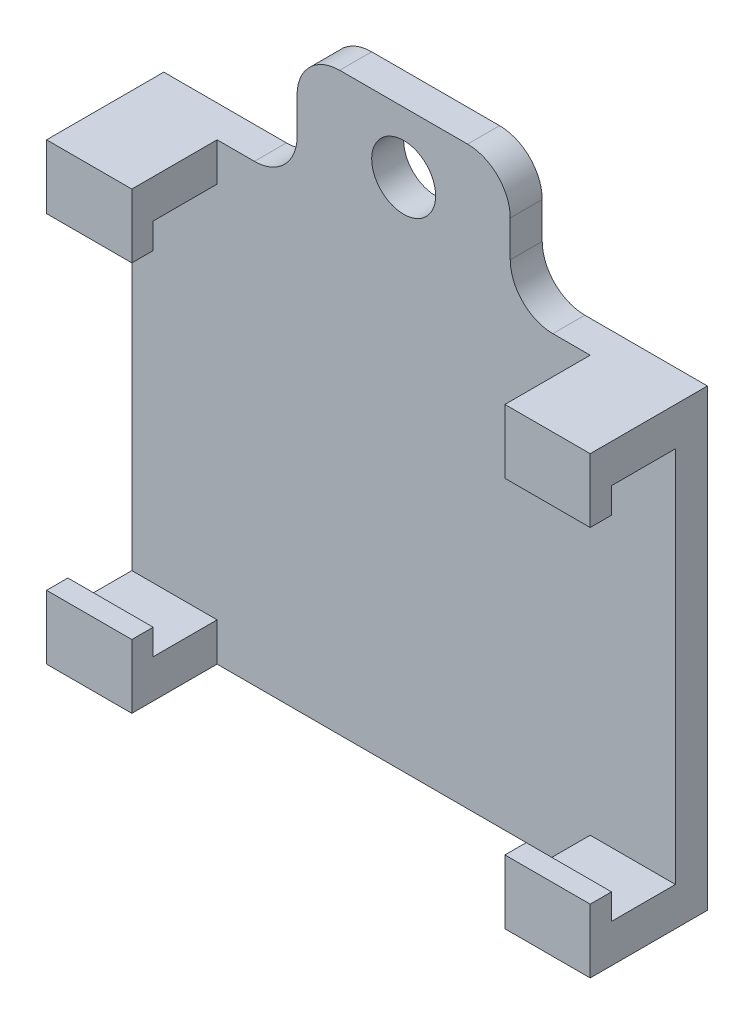
ISO-10303-21;
HEADER;
FILE_DESCRIPTION(('STEP AP214'),'2;1');
FILE_NAME('part.step','',(''),(''),'','','');
FILE_SCHEMA(('AUTOMOTIVE_DESIGN { 1 0 10303 214 1 1 1 1 }'));
ENDSEC;
DATA;
#1=APPLICATION_CONTEXT('core data for automotive mechanical design processes');
#2=APPLICATION_PROTOCOL_DEFINITION('international standard','automotive_design',2000,#1);
#3=PRODUCT_CONTEXT('',#1,'mechanical');
#4=PRODUCT('Part','Part','',(#3));
#5=PRODUCT_RELATED_PRODUCT_CATEGORY('part','',(#4));
#6=PRODUCT_DEFINITION_FORMATION('','',#4);
#7=PRODUCT_DEFINITION_CONTEXT('part definition',#1,'design');
#8=PRODUCT_DEFINITION('design','',#6,#7);
#9=PRODUCT_DEFINITION_SHAPE('','',#8);
#10=(LENGTH_UNIT() NAMED_UNIT(*) SI_UNIT(.MILLI.,.METRE.));
#11=(NAMED_UNIT(*) PLANE_ANGLE_UNIT() SI_UNIT($,.RADIAN.));
#12=(NAMED_UNIT(*) SI_UNIT($,.STERADIAN.) SOLID_ANGLE_UNIT());
#13=UNCERTAINTY_MEASURE_WITH_UNIT(LENGTH_MEASURE(1.E-05),#10,'distance_accuracy_value','');
#14=(GEOMETRIC_REPRESENTATION_CONTEXT(3) GLOBAL_UNCERTAINTY_ASSIGNED_CONTEXT((#13)) GLOBAL_UNIT_ASSIGNED_CONTEXT((#10,
#11,#12)) REPRESENTATION_CONTEXT('',''));
#15=CARTESIAN_POINT('',(0.,0.,0.));
#16=DIRECTION('',(0.,0.,1.));
#17=DIRECTION('',(1.,0.,0.));
#18=AXIS2_PLACEMENT_3D('',#15,#16,#17);
#19=CARTESIAN_POINT('',(0.,6.04999999999999,-17.95));
#20=DIRECTION('',(0.,1.,0.));
#21=DIRECTION('',(-1.,0.,0.));
#22=AXIS2_PLACEMENT_3D('',#19,#20,#21);
#23=PLANE('',#22);
#24=DIRECTION('',(-1.,0.,0.));
#25=VECTOR('',#24,1.);
#26=CARTESIAN_POINT('',(0.,6.05,-18.95));
#27=LINE('',#26,#25);
#28=CARTESIAN_POINT('',(4.00000000000001,6.05,-18.95));
#29=VERTEX_POINT('',#28);
#30=CARTESIAN_POINT('',(0.,6.05,-18.95));
#31=VERTEX_POINT('',#30);
#32=EDGE_CURVE('E445',#29,#31,#27,.T.);
#33=ORIENTED_EDGE('',*,*,#32,.F.);
#34=DIRECTION('',(0.,0.,1.));
#35=VECTOR('',#34,1.);
#36=CARTESIAN_POINT('',(4.00000000000001,6.04999999999999,-17.95));
#37=LINE('',#36,#35);
#38=CARTESIAN_POINT('',(4.00000000000001,6.04999999999999,-17.95));
#39=VERTEX_POINT('',#38);
#40=EDGE_CURVE('E411',#29,#39,#37,.T.);
#41=ORIENTED_EDGE('',*,*,#40,.T.);
#42=DIRECTION('',(1.,0.,0.));
#43=VECTOR('',#42,1.);
#44=CARTESIAN_POINT('',(0.,6.04999999999999,-17.95));
#45=LINE('',#44,#43);
#46=CARTESIAN_POINT('',(0.,6.04999999999999,-17.95));
#47=VERTEX_POINT('',#46);
#48=EDGE_CURVE('E493',#47,#39,#45,.T.);
#49=ORIENTED_EDGE('',*,*,#48,.F.);
#50=DIRECTION('',(0.,0.,-1.));
#51=VECTOR('',#50,1.);
#52=CARTESIAN_POINT('',(0.,6.04999999999999,-17.95));
#53=LINE('',#52,#51);
#54=EDGE_CURVE('E281',#47,#31,#53,.T.);
#55=ORIENTED_EDGE('',*,*,#54,.T.);
#56=EDGE_LOOP('',(#33,#41,#49,#55));
#57=FACE_BOUND('',#56,.T.);
#58=ADVANCED_FACE('F39',(#57),#23,.F.);
#59=CARTESIAN_POINT('',(0.,9.05,-17.95));
#60=DIRECTION('',(0.,-1.,0.));
#61=DIRECTION('',(1.,0.,0.));
#62=AXIS2_PLACEMENT_3D('',#59,#60,#61);
#63=PLANE('',#62);
#64=DIRECTION('',(1.,0.,0.));
#65=VECTOR('',#64,1.);
#66=CARTESIAN_POINT('',(0.,9.05000000000001,-21.95));
#67=LINE('',#66,#65);
#68=CARTESIAN_POINT('',(4.,9.05000000000001,-21.95));
#69=VERTEX_POINT('',#68);
#70=CARTESIAN_POINT('',(5.75,9.05000000000001,-21.95));
#71=VERTEX_POINT('',#70);
#72=EDGE_CURVE('E353',#69,#71,#67,.T.);
#73=ORIENTED_EDGE('',*,*,#72,.T.);
#74=DIRECTION('',(0.,0.,1.));
#75=VECTOR('',#74,1.);
#76=CARTESIAN_POINT('',(5.75,9.05000000000002,-23.45));
#77=LINE('',#76,#75);
#78=CARTESIAN_POINT('',(5.75,9.05000000000002,-23.45));
#79=VERTEX_POINT('',#78);
#80=EDGE_CURVE('E268',#71,#79,#77,.F.);
#81=ORIENTED_EDGE('',*,*,#80,.T.);
#82=DIRECTION('',(1.,0.,0.));
#83=VECTOR('',#82,1.);
#84=CARTESIAN_POINT('',(0.,9.05000000000002,-23.45));
#85=LINE('',#84,#83);
#86=CARTESIAN_POINT('',(0.,9.05000000000002,-23.45));
#87=VERTEX_POINT('',#86);
#88=EDGE_CURVE('E264',#87,#79,#85,.T.);
#89=ORIENTED_EDGE('',*,*,#88,.F.);
#90=DIRECTION('',(0.,0.,-1.));
#91=VECTOR('',#90,1.);
#92=CARTESIAN_POINT('',(0.,9.05,-17.95));
#93=LINE('',#92,#91);
#94=CARTESIAN_POINT('',(0.,9.05,-17.95));
#95=VERTEX_POINT('',#94);
#96=EDGE_CURVE('E248',#95,#87,#93,.T.);
#97=ORIENTED_EDGE('',*,*,#96,.F.);
#98=DIRECTION('',(-1.,0.,0.));
#99=VECTOR('',#98,1.);
#100=CARTESIAN_POINT('',(0.,9.05,-17.95));
#101=LINE('',#100,#99);
#102=CARTESIAN_POINT('',(4.00000000000001,9.05,-17.95));
#103=VERTEX_POINT('',#102);
#104=EDGE_CURVE('E498',#103,#95,#101,.T.);
#105=ORIENTED_EDGE('',*,*,#104,.F.);
#106=DIRECTION('',(0.,0.,-1.));
#107=VECTOR('',#106,1.);
#108=CARTESIAN_POINT('',(4.00000000000001,9.05,-17.95));
#109=LINE('',#108,#107);
#110=EDGE_CURVE('E414',#103,#69,#109,.T.);
#111=ORIENTED_EDGE('',*,*,#110,.T.);
#112=EDGE_LOOP('',(#73,#81,#89,#97,#105,#111));
#113=FACE_BOUND('',#112,.T.);
#114=ADVANCED_FACE('F266',(#113),#63,.F.);
#115=CARTESIAN_POINT('',(0.,-17.95,-17.9500000000001));
#116=DIRECTION('',(0.,0.,-1.));
#117=DIRECTION('',(0.,1.,0.));
#118=AXIS2_PLACEMENT_3D('',#115,#116,#117);
#119=PLANE('',#118);
#120=ORIENTED_EDGE('',*,*,#48,.T.);
#121=DIRECTION('',(0.,-1.,0.));
#122=VECTOR('',#121,1.);
#123=CARTESIAN_POINT('',(4.00000000000001,14.75,-17.95));
#124=LINE('',#123,#122);
#125=EDGE_CURVE('E372',#103,#39,#124,.T.);
#126=ORIENTED_EDGE('',*,*,#125,.F.);
#127=ORIENTED_EDGE('',*,*,#104,.T.);
#128=DIRECTION('',(0.,-1.,0.));
#129=VECTOR('',#128,1.);
#130=CARTESIAN_POINT('',(0.,6.04999999999999,-17.95));
#131=LINE('',#130,#129);
#132=EDGE_CURVE('E257',#95,#47,#131,.T.);
#133=ORIENTED_EDGE('',*,*,#132,.T.);
#134=EDGE_LOOP('',(#120,#126,#127,#133));
#135=FACE_BOUND('',#134,.T.);
#136=ADVANCED_FACE('F538',(#135),#119,.F.);
#137=CARTESIAN_POINT('',(0.,-9.25000000000001,-17.95));
#138=DIRECTION('',(0.,-1.,0.));
#139=DIRECTION('',(1.,0.,0.));
#140=AXIS2_PLACEMENT_3D('',#137,#138,#139);
#141=PLANE('',#140);
#142=DIRECTION('',(-1.,0.,0.));
#143=VECTOR('',#142,1.);
#144=CARTESIAN_POINT('',(0.,-9.25000000000001,-17.95));
#145=LINE('',#144,#143);
#146=CARTESIAN_POINT('',(4.00000000000001,-9.25000000000001,-17.95));
#147=VERTEX_POINT('',#146);
#148=CARTESIAN_POINT('',(0.,-9.25000000000001,-17.95));
#149=VERTEX_POINT('',#148);
#150=EDGE_CURVE('E477',#147,#149,#145,.T.);
#151=ORIENTED_EDGE('',*,*,#150,.F.);
#152=DIRECTION('',(0.,0.,-1.));
#153=VECTOR('',#152,1.);
#154=CARTESIAN_POINT('',(4.00000000000001,-9.25000000000001,-17.9500000000001));
#155=LINE('',#154,#153);
#156=CARTESIAN_POINT('',(4.00000000000001,-9.25,-18.95));
#157=VERTEX_POINT('',#156);
#158=EDGE_CURVE('E402',#147,#157,#155,.T.);
#159=ORIENTED_EDGE('',*,*,#158,.T.);
#160=DIRECTION('',(1.,0.,0.));
#161=VECTOR('',#160,1.);
#162=CARTESIAN_POINT('',(25.5,-9.25,-18.95));
#163=LINE('',#162,#161);
#164=CARTESIAN_POINT('',(0.,-9.25,-18.95));
#165=VERTEX_POINT('',#164);
#166=EDGE_CURVE('E429',#165,#157,#163,.T.);
#167=ORIENTED_EDGE('',*,*,#166,.F.);
#168=DIRECTION('',(0.,0.,-1.));
#169=VECTOR('',#168,1.);
#170=CARTESIAN_POINT('',(0.,-9.25000000000001,-17.95));
#171=LINE('',#170,#169);
#172=EDGE_CURVE('E481',#149,#165,#171,.T.);
#173=ORIENTED_EDGE('',*,*,#172,.F.);
#174=EDGE_LOOP('',(#151,#159,#167,#173));
#175=FACE_BOUND('',#174,.T.);
#176=ADVANCED_FACE('F563',(#175),#141,.F.);
#177=CARTESIAN_POINT('',(0.,-17.95,-17.9500000000001));
#178=DIRECTION('',(0.,0.,1.));
#179=DIRECTION('',(0.,-1.,0.));
#180=AXIS2_PLACEMENT_3D('',#177,#178,#179);
#181=PLANE('',#180);
#182=CARTESIAN_POINT('',(4.00000000000001,-12.25,-17.9500000000001));
#183=VERTEX_POINT('',#182);
#184=EDGE_CURVE('E370',#147,#183,#124,.T.);
#185=ORIENTED_EDGE('',*,*,#184,.F.);
#186=ORIENTED_EDGE('',*,*,#150,.T.);
#187=DIRECTION('',(0.,-1.,0.));
#188=VECTOR('',#187,1.);
#189=CARTESIAN_POINT('',(0.,-9.25000000000001,-17.95));
#190=LINE('',#189,#188);
#191=CARTESIAN_POINT('',(0.,-12.25,-17.9500000000001));
#192=VERTEX_POINT('',#191);
#193=EDGE_CURVE('E467',#149,#192,#190,.T.);
#194=ORIENTED_EDGE('',*,*,#193,.T.);
#195=DIRECTION('',(1.,0.,0.));
#196=VECTOR('',#195,1.);
#197=CARTESIAN_POINT('',(0.,-12.25,-17.9500000000001));
#198=LINE('',#197,#196);
#199=EDGE_CURVE('E472',#192,#183,#198,.T.);
#200=ORIENTED_EDGE('',*,*,#199,.T.);
#201=EDGE_LOOP('',(#185,#186,#194,#200));
#202=FACE_BOUND('',#201,.T.);
#203=ADVANCED_FACE('F567',(#202),#181,.T.);
#204=CARTESIAN_POINT('',(0.,7.25,-18.95));
#205=DIRECTION('',(0.,0.,1.));
#206=DIRECTION('',(0.,-1.,0.));
#207=AXIS2_PLACEMENT_3D('',#204,#205,#206);
#208=PLANE('',#207);
#209=DIRECTION('',(-1.,0.,0.));
#210=VECTOR('',#209,1.);
#211=CARTESIAN_POINT('',(0.,7.25,-18.95));
#212=LINE('',#211,#210);
#213=CARTESIAN_POINT('',(4.00000000000001,7.25,-18.95));
#214=VERTEX_POINT('',#213);
#215=CARTESIAN_POINT('',(0.,7.25,-18.95));
#216=VERTEX_POINT('',#215);
#217=EDGE_CURVE('E457',#214,#216,#212,.T.);
#218=ORIENTED_EDGE('',*,*,#217,.F.);
#219=DIRECTION('',(0.,-1.,0.));
#220=VECTOR('',#219,1.);
#221=CARTESIAN_POINT('',(4.00000000000001,7.25,-18.95));
#222=LINE('',#221,#220);
#223=EDGE_CURVE('E408',#214,#29,#222,.T.);
#224=ORIENTED_EDGE('',*,*,#223,.T.);
#225=ORIENTED_EDGE('',*,*,#32,.T.);
#226=DIRECTION('',(0.,-1.,0.));
#227=VECTOR('',#226,1.);
#228=CARTESIAN_POINT('',(0.,7.25,-18.95));
#229=LINE('',#228,#227);
#230=EDGE_CURVE('E464',#216,#31,#229,.T.);
#231=ORIENTED_EDGE('',*,*,#230,.F.);
#232=EDGE_LOOP('',(#218,#224,#225,#231));
#233=FACE_BOUND('',#232,.T.);
#234=ADVANCED_FACE('F543',(#233),#208,.F.);
#235=CARTESIAN_POINT('',(0.,7.25000000000001,-23.45));
#236=DIRECTION('',(0.,1.,0.));
#237=DIRECTION('',(-1.,0.,0.));
#238=AXIS2_PLACEMENT_3D('',#235,#236,#237);
#239=PLANE('',#238);
#240=DIRECTION('',(1.,0.,0.));
#241=VECTOR('',#240,1.);
#242=CARTESIAN_POINT('',(0.,7.25000000000001,-21.95));
#243=LINE('',#242,#241);
#244=CARTESIAN_POINT('',(0.,7.25000000000001,-21.95));
#245=VERTEX_POINT('',#244);
#246=CARTESIAN_POINT('',(4.,7.25000000000001,-21.95));
#247=VERTEX_POINT('',#246);
#248=EDGE_CURVE('E452',#245,#247,#243,.T.);
#249=ORIENTED_EDGE('',*,*,#248,.T.);
#250=DIRECTION('',(0.,0.,1.));
#251=VECTOR('',#250,1.);
#252=CARTESIAN_POINT('',(4.,7.25000000000001,-23.45));
#253=LINE('',#252,#251);
#254=EDGE_CURVE('E405',#247,#214,#253,.T.);
#255=ORIENTED_EDGE('',*,*,#254,.T.);
#256=ORIENTED_EDGE('',*,*,#217,.T.);
#257=DIRECTION('',(0.,0.,-1.));
#258=VECTOR('',#257,1.);
#259=CARTESIAN_POINT('',(0.,7.25000000000001,-21.95));
#260=LINE('',#259,#258);
#261=EDGE_CURVE('E447',#216,#245,#260,.T.);
#262=ORIENTED_EDGE('',*,*,#261,.T.);
#263=EDGE_LOOP('',(#249,#255,#256,#262));
#264=FACE_BOUND('',#263,.T.);
#265=ADVANCED_FACE('F547',(#264),#239,.F.);
#266=CARTESIAN_POINT('',(25.5,-10.45,-18.95));
#267=DIRECTION('',(0.,0.,1.));
#268=DIRECTION('',(0.,-1.,0.));
#269=AXIS2_PLACEMENT_3D('',#266,#267,#268);
#270=PLANE('',#269);
#271=ORIENTED_EDGE('',*,*,#166,.T.);
#272=DIRECTION('',(0.,-1.,0.));
#273=VECTOR('',#272,1.);
#274=CARTESIAN_POINT('',(4.00000000000001,-10.45,-18.95));
#275=LINE('',#274,#273);
#276=CARTESIAN_POINT('',(4.00000000000001,-10.45,-18.95));
#277=VERTEX_POINT('',#276);
#278=EDGE_CURVE('E399',#157,#277,#275,.T.);
#279=ORIENTED_EDGE('',*,*,#278,.T.);
#280=DIRECTION('',(1.,0.,0.));
#281=VECTOR('',#280,1.);
#282=CARTESIAN_POINT('',(25.5,-10.45,-18.95));
#283=LINE('',#282,#281);
#284=CARTESIAN_POINT('',(0.,-10.45,-18.95));
#285=VERTEX_POINT('',#284);
#286=EDGE_CURVE('E436',#285,#277,#283,.T.);
#287=ORIENTED_EDGE('',*,*,#286,.F.);
#288=DIRECTION('',(0.,1.,0.));
#289=VECTOR('',#288,1.);
#290=CARTESIAN_POINT('',(0.,-10.45,-18.95));
#291=LINE('',#290,#289);
#292=EDGE_CURVE('E439',#285,#165,#291,.T.);
#293=ORIENTED_EDGE('',*,*,#292,.T.);
#294=EDGE_LOOP('',(#271,#279,#287,#293));
#295=FACE_BOUND('',#294,.T.);
#296=ADVANCED_FACE('F556',(#295),#270,.F.);
#297=CARTESIAN_POINT('',(0.,-10.45,-23.45));
#298=DIRECTION('',(0.,-1.,0.));
#299=DIRECTION('',(1.,0.,0.));
#300=AXIS2_PLACEMENT_3D('',#297,#298,#299);
#301=PLANE('',#300);
#302=ORIENTED_EDGE('',*,*,#286,.T.);
#303=DIRECTION('',(0.,0.,-1.));
#304=VECTOR('',#303,1.);
#305=CARTESIAN_POINT('',(4.,-10.45,-23.4500000000001));
#306=LINE('',#305,#304);
#307=CARTESIAN_POINT('',(4.,-10.45,-21.95));
#308=VERTEX_POINT('',#307);
#309=EDGE_CURVE('E299',#277,#308,#306,.T.);
#310=ORIENTED_EDGE('',*,*,#309,.T.);
#311=DIRECTION('',(-1.,0.,0.));
#312=VECTOR('',#311,1.);
#313=CARTESIAN_POINT('',(25.5,-10.45,-21.95));
#314=LINE('',#313,#312);
#315=CARTESIAN_POINT('',(0.,-10.45,-21.95));
#316=VERTEX_POINT('',#315);
#317=EDGE_CURVE('E428',#308,#316,#314,.T.);
#318=ORIENTED_EDGE('',*,*,#317,.T.);
#319=DIRECTION('',(0.,0.,1.));
#320=VECTOR('',#319,1.);
#321=CARTESIAN_POINT('',(0.,-10.45,-21.95));
#322=LINE('',#321,#320);
#323=EDGE_CURVE('E433',#316,#285,#322,.T.);
#324=ORIENTED_EDGE('',*,*,#323,.T.);
#325=EDGE_LOOP('',(#302,#310,#318,#324));
#326=FACE_BOUND('',#325,.T.);
#327=ADVANCED_FACE('F554',(#326),#301,.F.);
#328=CARTESIAN_POINT('',(0.,-17.95,-21.9500000000001));
#329=DIRECTION('',(1.,0.,0.));
#330=DIRECTION('',(0.,1.,0.));
#331=AXIS2_PLACEMENT_3D('',#328,#329,#330);
#332=PLANE('',#331);
#333=ORIENTED_EDGE('',*,*,#96,.T.);
#334=DIRECTION('',(0.,-1.,0.));
#335=VECTOR('',#334,1.);
#336=CARTESIAN_POINT('',(0.,-17.95,-23.4500000000001));
#337=LINE('',#336,#335);
#338=CARTESIAN_POINT('',(0.,-12.25,-23.4500000000001));
#339=VERTEX_POINT('',#338);
#340=EDGE_CURVE('E253',#87,#339,#337,.T.);
#341=ORIENTED_EDGE('',*,*,#340,.T.);
#342=DIRECTION('',(0.,0.,-1.));
#343=VECTOR('',#342,1.);
#344=CARTESIAN_POINT('',(0.,-12.25,-17.9500000000001));
#345=LINE('',#344,#343);
#346=EDGE_CURVE('E489',#192,#339,#345,.T.);
#347=ORIENTED_EDGE('',*,*,#346,.F.);
#348=ORIENTED_EDGE('',*,*,#193,.F.);
#349=ORIENTED_EDGE('',*,*,#172,.T.);
#350=ORIENTED_EDGE('',*,*,#292,.F.);
#351=ORIENTED_EDGE('',*,*,#323,.F.);
#352=DIRECTION('',(0.,-1.,0.));
#353=VECTOR('',#352,1.);
#354=CARTESIAN_POINT('',(0.,-17.95,-21.9500000000001));
#355=LINE('',#354,#353);
#356=EDGE_CURVE('E295',#245,#316,#355,.T.);
#357=ORIENTED_EDGE('',*,*,#356,.F.);
#358=ORIENTED_EDGE('',*,*,#261,.F.);
#359=ORIENTED_EDGE('',*,*,#230,.T.);
#360=ORIENTED_EDGE('',*,*,#54,.F.);
#361=ORIENTED_EDGE('',*,*,#132,.F.);
#362=EDGE_LOOP('',(#333,#341,#347,#348,#349,#350,#351,#357,#358,#359,#360,#361));
#363=FACE_BOUND('',#362,.T.);
#364=ADVANCED_FACE('F250',(#363),#332,.F.);
#365=CARTESIAN_POINT('',(25.5,-17.95,-21.9500000000001));
#366=DIRECTION('',(-1.,0.,0.));
#367=DIRECTION('',(0.,-1.,0.));
#368=AXIS2_PLACEMENT_3D('',#365,#366,#367);
#369=PLANE('',#368);
#370=DIRECTION('',(0.,1.,0.));
#371=VECTOR('',#370,1.);
#372=CARTESIAN_POINT('',(25.5,-17.95,-23.4500000000001));
#373=LINE('',#372,#371);
#374=CARTESIAN_POINT('',(25.5,-12.25,-23.4500000000001));
#375=VERTEX_POINT('',#374);
#376=CARTESIAN_POINT('',(25.5,9.05000000000002,-23.45));
#377=VERTEX_POINT('',#376);
#378=EDGE_CURVE('E280',#375,#377,#373,.T.);
#379=ORIENTED_EDGE('',*,*,#378,.T.);
#380=DIRECTION('',(0.,0.,-1.));
#381=VECTOR('',#380,1.);
#382=CARTESIAN_POINT('',(25.5,9.05,-17.95));
#383=LINE('',#382,#381);
#384=CARTESIAN_POINT('',(25.5,9.05,-17.95));
#385=VERTEX_POINT('',#384);
#386=EDGE_CURVE('E260',#385,#377,#383,.T.);
#387=ORIENTED_EDGE('',*,*,#386,.F.);
#388=DIRECTION('',(0.,1.,0.));
#389=VECTOR('',#388,1.);
#390=CARTESIAN_POINT('',(25.5,6.04999999999999,-17.95));
#391=LINE('',#390,#389);
#392=CARTESIAN_POINT('',(25.5,6.04999999999999,-17.95));
#393=VERTEX_POINT('',#392);
#394=EDGE_CURVE('E496',#393,#385,#391,.T.);
#395=ORIENTED_EDGE('',*,*,#394,.F.);
#396=DIRECTION('',(0.,0.,-1.));
#397=VECTOR('',#396,1.);
#398=CARTESIAN_POINT('',(25.5,6.04999999999999,-17.95));
#399=LINE('',#398,#397);
#400=CARTESIAN_POINT('',(25.5,6.05,-18.95));
#401=VERTEX_POINT('',#400);
#402=EDGE_CURVE('E287',#393,#401,#399,.T.);
#403=ORIENTED_EDGE('',*,*,#402,.T.);
#404=DIRECTION('',(0.,-1.,0.));
#405=VECTOR('',#404,1.);
#406=CARTESIAN_POINT('',(25.5,7.25,-18.95));
#407=LINE('',#406,#405);
#408=CARTESIAN_POINT('',(25.5,7.25,-18.95));
#409=VERTEX_POINT('',#408);
#410=EDGE_CURVE('E461',#409,#401,#407,.T.);
#411=ORIENTED_EDGE('',*,*,#410,.F.);
#412=DIRECTION('',(0.,0.,1.));
#413=VECTOR('',#412,1.);
#414=CARTESIAN_POINT('',(25.5,7.25000000000001,-21.95));
#415=LINE('',#414,#413);
#416=CARTESIAN_POINT('',(25.5,7.25000000000001,-21.95));
#417=VERTEX_POINT('',#416);
#418=EDGE_CURVE('E455',#417,#409,#415,.T.);
#419=ORIENTED_EDGE('',*,*,#418,.F.);
#420=DIRECTION('',(0.,1.,0.));
#421=VECTOR('',#420,1.);
#422=CARTESIAN_POINT('',(25.5,-17.95,-21.9500000000001));
#423=LINE('',#422,#421);
#424=CARTESIAN_POINT('',(25.5,-10.45,-21.95));
#425=VERTEX_POINT('',#424);
#426=EDGE_CURVE('E505',#425,#417,#423,.T.);
#427=ORIENTED_EDGE('',*,*,#426,.F.);
#428=DIRECTION('',(0.,0.,-1.));
#429=VECTOR('',#428,1.);
#430=CARTESIAN_POINT('',(25.5,-10.45,-21.95));
#431=LINE('',#430,#429);
#432=CARTESIAN_POINT('',(25.5,-10.45,-18.95));
#433=VERTEX_POINT('',#432);
#434=EDGE_CURVE('E425',#433,#425,#431,.T.);
#435=ORIENTED_EDGE('',*,*,#434,.F.);
#436=DIRECTION('',(0.,1.,0.));
#437=VECTOR('',#436,1.);
#438=CARTESIAN_POINT('',(25.5,-10.45,-18.95));
#439=LINE('',#438,#437);
#440=CARTESIAN_POINT('',(25.5,-9.25,-18.95));
#441=VERTEX_POINT('',#440);
#442=EDGE_CURVE('E442',#433,#441,#439,.T.);
#443=ORIENTED_EDGE('',*,*,#442,.T.);
#444=DIRECTION('',(0.,0.,-1.));
#445=VECTOR('',#444,1.);
#446=CARTESIAN_POINT('',(25.5,-9.25000000000001,-17.95));
#447=LINE('',#446,#445);
#448=CARTESIAN_POINT('',(25.5,-9.25000000000001,-17.95));
#449=VERTEX_POINT('',#448);
#450=EDGE_CURVE('E484',#449,#441,#447,.T.);
#451=ORIENTED_EDGE('',*,*,#450,.F.);
#452=DIRECTION('',(0.,1.,0.));
#453=VECTOR('',#452,1.);
#454=CARTESIAN_POINT('',(25.5,-9.25000000000001,-17.95));
#455=LINE('',#454,#453);
#456=CARTESIAN_POINT('',(25.5,-12.25,-17.9500000000001));
#457=VERTEX_POINT('',#456);
#458=EDGE_CURVE('E475',#457,#449,#455,.T.);
#459=ORIENTED_EDGE('',*,*,#458,.F.);
#460=DIRECTION('',(0.,0.,-1.));
#461=VECTOR('',#460,1.);
#462=CARTESIAN_POINT('',(25.5,-12.25,-17.9500000000001));
#463=LINE('',#462,#461);
#464=EDGE_CURVE('E487',#457,#375,#463,.T.);
#465=ORIENTED_EDGE('',*,*,#464,.T.);
#466=EDGE_LOOP('',(#379,#387,#395,#403,#411,#419,#427,#435,#443,#451,#459,#465));
#467=FACE_BOUND('',#466,.T.);
#468=ADVANCED_FACE('F583',(#467),#369,.F.);
#469=CARTESIAN_POINT('',(0.,-17.95,-23.4500000000001));
#470=DIRECTION('',(0.,0.,-1.));
#471=DIRECTION('',(0.,1.,0.));
#472=AXIS2_PLACEMENT_3D('',#469,#470,#471);
#473=PLANE('',#472);
#474=DIRECTION('',(0.,1.,0.));
#475=VECTOR('',#474,1.);
#476=CARTESIAN_POINT('',(7.75,14.75,-23.45));
#477=LINE('',#476,#475);
#478=CARTESIAN_POINT('',(7.75,11.05,-23.45));
#479=VERTEX_POINT('',#478);
#480=CARTESIAN_POINT('',(7.75,12.75,-23.45));
#481=VERTEX_POINT('',#480);
#482=EDGE_CURVE('E270',#479,#481,#477,.T.);
#483=ORIENTED_EDGE('',*,*,#482,.T.);
#484=CARTESIAN_POINT('',(9.75,12.75,-23.45));
#485=DIRECTION('',(0.,0.,-1.));
#486=DIRECTION('',(0.,1.,0.));
#487=AXIS2_PLACEMENT_3D('',#484,#485,#486);
#488=CIRCLE('',#487,2.);
#489=CARTESIAN_POINT('',(9.75,14.75,-23.45));
#490=VERTEX_POINT('',#489);
#491=EDGE_CURVE('E319',#481,#490,#488,.T.);
#492=ORIENTED_EDGE('',*,*,#491,.T.);
#493=DIRECTION('',(-1.,0.,0.));
#494=VECTOR('',#493,1.);
#495=CARTESIAN_POINT('',(0.,14.75,-23.45));
#496=LINE('',#495,#494);
#497=CARTESIAN_POINT('',(15.75,14.75,-23.45));
#498=VERTEX_POINT('',#497);
#499=EDGE_CURVE('E284',#498,#490,#496,.T.);
#500=ORIENTED_EDGE('',*,*,#499,.F.);
#501=CARTESIAN_POINT('',(15.75,12.75,-23.45));
#502=DIRECTION('',(0.,0.,-1.));
#503=DIRECTION('',(0.,1.,0.));
#504=AXIS2_PLACEMENT_3D('',#501,#502,#503);
#505=CIRCLE('',#504,2.);
#506=CARTESIAN_POINT('',(17.75,12.75,-23.45));
#507=VERTEX_POINT('',#506);
#508=EDGE_CURVE('E317',#498,#507,#505,.T.);
#509=ORIENTED_EDGE('',*,*,#508,.T.);
#510=DIRECTION('',(0.,-1.,0.));
#511=VECTOR('',#510,1.);
#512=CARTESIAN_POINT('',(17.75,14.75,-23.45));
#513=LINE('',#512,#511);
#514=CARTESIAN_POINT('',(17.75,11.05,-23.45));
#515=VERTEX_POINT('',#514);
#516=EDGE_CURVE('E354',#507,#515,#513,.T.);
#517=ORIENTED_EDGE('',*,*,#516,.T.);
#518=CARTESIAN_POINT('',(19.75,11.05,-23.45));
#519=DIRECTION('',(0.,0.,-1.));
#520=DIRECTION('',(0.,1.,0.));
#521=AXIS2_PLACEMENT_3D('',#518,#519,#520);
#522=CIRCLE('',#521,2.);
#523=CARTESIAN_POINT('',(19.75,9.05000000000002,-23.45));
#524=VERTEX_POINT('',#523);
#525=EDGE_CURVE('E12',#515,#524,#522,.F.);
#526=ORIENTED_EDGE('',*,*,#525,.T.);
#527=DIRECTION('',(1.,0.,0.));
#528=VECTOR('',#527,1.);
#529=CARTESIAN_POINT('',(25.5,9.05000000000002,-23.45));
#530=LINE('',#529,#528);
#531=EDGE_CURVE('E350',#524,#377,#530,.T.);
#532=ORIENTED_EDGE('',*,*,#531,.T.);
#533=ORIENTED_EDGE('',*,*,#378,.F.);
#534=DIRECTION('',(-1.,0.,0.));
#535=VECTOR('',#534,1.);
#536=CARTESIAN_POINT('',(0.,-12.25,-23.4500000000001));
#537=LINE('',#536,#535);
#538=EDGE_CURVE('E279',#375,#339,#537,.T.);
#539=ORIENTED_EDGE('',*,*,#538,.T.);
#540=ORIENTED_EDGE('',*,*,#340,.F.);
#541=ORIENTED_EDGE('',*,*,#88,.T.);
#542=CARTESIAN_POINT('',(5.75,11.05,-23.45));
#543=DIRECTION('',(0.,0.,-1.));
#544=DIRECTION('',(0.,1.,0.));
#545=AXIS2_PLACEMENT_3D('',#542,#543,#544);
#546=CIRCLE('',#545,2.);
#547=EDGE_CURVE('E330',#79,#479,#546,.F.);
#548=ORIENTED_EDGE('',*,*,#547,.T.);
#549=EDGE_LOOP('',(#483,#492,#500,#509,#517,#526,#532,#533,#539,#540,#541,#548));
#550=FACE_BOUND('',#549,.T.);
#551=CARTESIAN_POINT('',(12.75,11.9,-23.45));
#552=DIRECTION('',(0.,0.,1.));
#553=DIRECTION('',(0.,-1.,0.));
#554=AXIS2_PLACEMENT_3D('',#551,#552,#553);
#555=CIRCLE('',#554,1.5);
#556=CARTESIAN_POINT('',(12.75,10.4,-23.45));
#557=VERTEX_POINT('',#556);
#558=EDGE_CURVE('E419',#557,#557,#555,.T.);
#559=ORIENTED_EDGE('',*,*,#558,.T.);
#560=EDGE_LOOP('',(#559));
#561=FACE_BOUND('',#560,.T.);
#562=ADVANCED_FACE('F275',(#550,#561),#473,.T.);
#563=CARTESIAN_POINT('',(0.,-17.95,-21.9500000000001));
#564=DIRECTION('',(0.,0.,-1.));
#565=DIRECTION('',(0.,1.,0.));
#566=AXIS2_PLACEMENT_3D('',#563,#564,#565);
#567=PLANE('',#566);
#568=DIRECTION('',(-1.,0.,0.));
#569=VECTOR('',#568,1.);
#570=CARTESIAN_POINT('',(0.,14.75,-21.95));
#571=LINE('',#570,#569);
#572=CARTESIAN_POINT('',(15.75,14.75,-21.95));
#573=VERTEX_POINT('',#572);
#574=CARTESIAN_POINT('',(9.75,14.75,-21.95));
#575=VERTEX_POINT('',#574);
#576=EDGE_CURVE('E290',#573,#575,#571,.T.);
#577=ORIENTED_EDGE('',*,*,#576,.T.);
#578=CARTESIAN_POINT('',(9.75,12.75,-21.95));
#579=DIRECTION('',(0.,0.,-1.));
#580=DIRECTION('',(0.,1.,0.));
#581=AXIS2_PLACEMENT_3D('',#578,#579,#580);
#582=CIRCLE('',#581,2.);
#583=CARTESIAN_POINT('',(7.75,12.75,-21.95));
#584=VERTEX_POINT('',#583);
#585=EDGE_CURVE('E315',#575,#584,#582,.F.);
#586=ORIENTED_EDGE('',*,*,#585,.T.);
#587=DIRECTION('',(0.,1.,0.));
#588=VECTOR('',#587,1.);
#589=CARTESIAN_POINT('',(7.75,14.75,-21.95));
#590=LINE('',#589,#588);
#591=CARTESIAN_POINT('',(7.75,11.05,-21.95));
#592=VERTEX_POINT('',#591);
#593=EDGE_CURVE('E271',#592,#584,#590,.T.);
#594=ORIENTED_EDGE('',*,*,#593,.F.);
#595=CARTESIAN_POINT('',(5.75,11.05,-21.95));
#596=DIRECTION('',(0.,0.,-1.));
#597=DIRECTION('',(0.,1.,0.));
#598=AXIS2_PLACEMENT_3D('',#595,#596,#597);
#599=CIRCLE('',#598,2.);
#600=EDGE_CURVE('E328',#592,#71,#599,.T.);
#601=ORIENTED_EDGE('',*,*,#600,.T.);
#602=ORIENTED_EDGE('',*,*,#72,.F.);
#603=DIRECTION('',(0.,-1.,0.));
#604=VECTOR('',#603,1.);
#605=CARTESIAN_POINT('',(4.,14.75,-21.95));
#606=LINE('',#605,#604);
#607=EDGE_CURVE('E380',#69,#247,#606,.T.);
#608=ORIENTED_EDGE('',*,*,#607,.T.);
#609=ORIENTED_EDGE('',*,*,#248,.F.);
#610=ORIENTED_EDGE('',*,*,#356,.T.);
#611=ORIENTED_EDGE('',*,*,#317,.F.);
#612=CARTESIAN_POINT('',(4.,-12.25,-21.9500000000001));
#613=VERTEX_POINT('',#612);
#614=EDGE_CURVE('E369',#308,#613,#606,.T.);
#615=ORIENTED_EDGE('',*,*,#614,.T.);
#616=DIRECTION('',(1.,0.,0.));
#617=VECTOR('',#616,1.);
#618=CARTESIAN_POINT('',(4.,-12.25,-21.9500000000001));
#619=LINE('',#618,#617);
#620=CARTESIAN_POINT('',(21.5,-12.25,-21.9500000000001));
#621=VERTEX_POINT('',#620);
#622=EDGE_CURVE('E364',#613,#621,#619,.T.);
#623=ORIENTED_EDGE('',*,*,#622,.T.);
#624=DIRECTION('',(0.,-1.,0.));
#625=VECTOR('',#624,1.);
#626=CARTESIAN_POINT('',(21.5,14.75,-21.95));
#627=LINE('',#626,#625);
#628=CARTESIAN_POINT('',(21.5,-10.45,-21.95));
#629=VERTEX_POINT('',#628);
#630=EDGE_CURVE('E378',#629,#621,#627,.T.);
#631=ORIENTED_EDGE('',*,*,#630,.F.);
#632=EDGE_CURVE('E430',#425,#629,#314,.T.);
#633=ORIENTED_EDGE('',*,*,#632,.F.);
#634=ORIENTED_EDGE('',*,*,#426,.T.);
#635=CARTESIAN_POINT('',(21.5,7.25000000000001,-21.95));
#636=VERTEX_POINT('',#635);
#637=EDGE_CURVE('E450',#636,#417,#243,.T.);
#638=ORIENTED_EDGE('',*,*,#637,.F.);
#639=CARTESIAN_POINT('',(21.5,9.05000000000001,-21.95));
#640=VERTEX_POINT('',#639);
#641=EDGE_CURVE('E377',#640,#636,#627,.T.);
#642=ORIENTED_EDGE('',*,*,#641,.F.);
#643=DIRECTION('',(1.,0.,0.));
#644=VECTOR('',#643,1.);
#645=CARTESIAN_POINT('',(25.5,9.05000000000001,-21.95));
#646=LINE('',#645,#644);
#647=CARTESIAN_POINT('',(19.75,9.05000000000001,-21.95));
#648=VERTEX_POINT('',#647);
#649=EDGE_CURVE('E339',#648,#640,#646,.T.);
#650=ORIENTED_EDGE('',*,*,#649,.F.);
#651=CARTESIAN_POINT('',(19.75,11.05,-21.95));
#652=DIRECTION('',(0.,0.,-1.));
#653=DIRECTION('',(0.,1.,0.));
#654=AXIS2_PLACEMENT_3D('',#651,#652,#653);
#655=CIRCLE('',#654,2.);
#656=CARTESIAN_POINT('',(17.75,11.05,-21.95));
#657=VERTEX_POINT('',#656);
#658=EDGE_CURVE('E47',#648,#657,#655,.T.);
#659=ORIENTED_EDGE('',*,*,#658,.T.);
#660=DIRECTION('',(0.,-1.,0.));
#661=VECTOR('',#660,1.);
#662=CARTESIAN_POINT('',(17.75,14.75,-21.95));
#663=LINE('',#662,#661);
#664=CARTESIAN_POINT('',(17.75,12.75,-21.95));
#665=VERTEX_POINT('',#664);
#666=EDGE_CURVE('E337',#665,#657,#663,.T.);
#667=ORIENTED_EDGE('',*,*,#666,.F.);
#668=CARTESIAN_POINT('',(15.75,12.75,-21.95));
#669=DIRECTION('',(0.,0.,-1.));
#670=DIRECTION('',(0.,1.,0.));
#671=AXIS2_PLACEMENT_3D('',#668,#669,#670);
#672=CIRCLE('',#671,2.);
#673=EDGE_CURVE('E313',#665,#573,#672,.F.);
#674=ORIENTED_EDGE('',*,*,#673,.T.);
#675=EDGE_LOOP('',(#577,#586,#594,#601,#602,#608,#609,#610,#611,#615,#623,#631,#633,#634,#638,
#642,#650,#659,#667,#674));
#676=FACE_BOUND('',#675,.T.);
#677=CARTESIAN_POINT('',(12.75,11.9,-21.95));
#678=DIRECTION('',(0.,0.,1.));
#679=DIRECTION('',(0.,-1.,0.));
#680=AXIS2_PLACEMENT_3D('',#677,#678,#679);
#681=CIRCLE('',#680,1.5);
#682=CARTESIAN_POINT('',(12.75,10.4,-21.95));
#683=VERTEX_POINT('',#682);
#684=EDGE_CURVE('E418',#683,#683,#681,.T.);
#685=ORIENTED_EDGE('',*,*,#684,.F.);
#686=EDGE_LOOP('',(#685));
#687=FACE_BOUND('',#686,.T.);
#688=ADVANCED_FACE('F335',(#676,#687),#567,.F.);
#689=CARTESIAN_POINT('',(0.,14.75,-21.95));
#690=DIRECTION('',(0.,-1.,0.));
#691=DIRECTION('',(1.,0.,0.));
#692=AXIS2_PLACEMENT_3D('',#689,#690,#691);
#693=PLANE('',#692);
#694=ORIENTED_EDGE('',*,*,#499,.T.);
#695=DIRECTION('',(0.,0.,1.));
#696=VECTOR('',#695,1.);
#697=CARTESIAN_POINT('',(9.75,14.75,-21.95));
#698=LINE('',#697,#696);
#699=EDGE_CURVE('E310',#490,#575,#698,.T.);
#700=ORIENTED_EDGE('',*,*,#699,.T.);
#701=ORIENTED_EDGE('',*,*,#576,.F.);
#702=DIRECTION('',(0.,0.,1.));
#703=VECTOR('',#702,1.);
#704=CARTESIAN_POINT('',(15.75,14.75,-21.95));
#705=LINE('',#704,#703);
#706=EDGE_CURVE('E308',#573,#498,#705,.F.);
#707=ORIENTED_EDGE('',*,*,#706,.T.);
#708=EDGE_LOOP('',(#694,#700,#701,#707));
#709=FACE_BOUND('',#708,.T.);
#710=ADVANCED_FACE('F515',(#709),#693,.F.);
#711=CARTESIAN_POINT('',(21.5,6.04999999999999,-17.95));
#712=VERTEX_POINT('',#711);
#713=EDGE_CURVE('E492',#712,#393,#45,.T.);
#714=ORIENTED_EDGE('',*,*,#713,.F.);
#715=DIRECTION('',(0.,0.,-1.));
#716=VECTOR('',#715,1.);
#717=CARTESIAN_POINT('',(21.5,6.04999999999999,-17.95));
#718=LINE('',#717,#716);
#719=CARTESIAN_POINT('',(21.5,6.05,-18.95));
#720=VERTEX_POINT('',#719);
#721=EDGE_CURVE('E394',#712,#720,#718,.T.);
#722=ORIENTED_EDGE('',*,*,#721,.T.);
#723=EDGE_CURVE('E451',#401,#720,#27,.T.);
#724=ORIENTED_EDGE('',*,*,#723,.F.);
#725=ORIENTED_EDGE('',*,*,#402,.F.);
#726=EDGE_LOOP('',(#714,#722,#724,#725));
#727=FACE_BOUND('',#726,.T.);
#728=ADVANCED_FACE('F597',(#727),#23,.F.);
#729=ORIENTED_EDGE('',*,*,#531,.F.);
#730=DIRECTION('',(0.,0.,1.));
#731=VECTOR('',#730,1.);
#732=CARTESIAN_POINT('',(19.75,9.05000000000001,-21.95));
#733=LINE('',#732,#731);
#734=EDGE_CURVE('E325',#524,#648,#733,.T.);
#735=ORIENTED_EDGE('',*,*,#734,.T.);
#736=ORIENTED_EDGE('',*,*,#649,.T.);
#737=DIRECTION('',(0.,0.,1.));
#738=VECTOR('',#737,1.);
#739=CARTESIAN_POINT('',(21.5,9.05,-17.95));
#740=LINE('',#739,#738);
#741=CARTESIAN_POINT('',(21.5,9.05,-17.95));
#742=VERTEX_POINT('',#741);
#743=EDGE_CURVE('E397',#640,#742,#740,.T.);
#744=ORIENTED_EDGE('',*,*,#743,.T.);
#745=EDGE_CURVE('E261',#385,#742,#101,.T.);
#746=ORIENTED_EDGE('',*,*,#745,.F.);
#747=ORIENTED_EDGE('',*,*,#386,.T.);
#748=EDGE_LOOP('',(#729,#735,#736,#744,#746,#747));
#749=FACE_BOUND('',#748,.T.);
#750=ADVANCED_FACE('F346',(#749),#63,.F.);
#751=ORIENTED_EDGE('',*,*,#745,.T.);
#752=DIRECTION('',(0.,-1.,0.));
#753=VECTOR('',#752,1.);
#754=CARTESIAN_POINT('',(21.5,14.75,-17.95));
#755=LINE('',#754,#753);
#756=EDGE_CURVE('E373',#742,#712,#755,.T.);
#757=ORIENTED_EDGE('',*,*,#756,.T.);
#758=ORIENTED_EDGE('',*,*,#713,.T.);
#759=ORIENTED_EDGE('',*,*,#394,.T.);
#760=EDGE_LOOP('',(#751,#757,#758,#759));
#761=FACE_BOUND('',#760,.T.);
#762=ADVANCED_FACE('F601',(#761),#119,.F.);
#763=CARTESIAN_POINT('',(0.,-12.25,-17.9500000000001));
#764=DIRECTION('',(0.,1.,0.));
#765=DIRECTION('',(-1.,0.,0.));
#766=AXIS2_PLACEMENT_3D('',#763,#764,#765);
#767=PLANE('',#766);
#768=ORIENTED_EDGE('',*,*,#622,.F.);
#769=DIRECTION('',(0.,0.,-1.));
#770=VECTOR('',#769,1.);
#771=CARTESIAN_POINT('',(4.00000000000001,-12.25,-17.9500000000001));
#772=LINE('',#771,#770);
#773=EDGE_CURVE('E361',#183,#613,#772,.T.);
#774=ORIENTED_EDGE('',*,*,#773,.F.);
#775=ORIENTED_EDGE('',*,*,#199,.F.);
#776=ORIENTED_EDGE('',*,*,#346,.T.);
#777=ORIENTED_EDGE('',*,*,#538,.F.);
#778=ORIENTED_EDGE('',*,*,#464,.F.);
#779=CARTESIAN_POINT('',(21.5,-12.25,-17.9500000000001));
#780=VERTEX_POINT('',#779);
#781=EDGE_CURVE('E471',#780,#457,#198,.T.);
#782=ORIENTED_EDGE('',*,*,#781,.F.);
#783=DIRECTION('',(0.,0.,1.));
#784=VECTOR('',#783,1.);
#785=CARTESIAN_POINT('',(21.5,-12.25,-17.9500000000001));
#786=LINE('',#785,#784);
#787=EDGE_CURVE('E367',#621,#780,#786,.T.);
#788=ORIENTED_EDGE('',*,*,#787,.F.);
#789=EDGE_LOOP('',(#768,#774,#775,#776,#777,#778,#782,#788));
#790=FACE_BOUND('',#789,.T.);
#791=ADVANCED_FACE('F571',(#790),#767,.F.);
#792=CARTESIAN_POINT('',(21.5,-9.25,-18.95));
#793=VERTEX_POINT('',#792);
#794=EDGE_CURVE('E422',#793,#441,#163,.T.);
#795=ORIENTED_EDGE('',*,*,#794,.F.);
#796=DIRECTION('',(0.,0.,1.));
#797=VECTOR('',#796,1.);
#798=CARTESIAN_POINT('',(21.5,-9.25000000000001,-17.95));
#799=LINE('',#798,#797);
#800=CARTESIAN_POINT('',(21.5,-9.25000000000001,-17.95));
#801=VERTEX_POINT('',#800);
#802=EDGE_CURVE('E385',#793,#801,#799,.T.);
#803=ORIENTED_EDGE('',*,*,#802,.T.);
#804=EDGE_CURVE('E478',#449,#801,#145,.T.);
#805=ORIENTED_EDGE('',*,*,#804,.F.);
#806=ORIENTED_EDGE('',*,*,#450,.T.);
#807=EDGE_LOOP('',(#795,#803,#805,#806));
#808=FACE_BOUND('',#807,.T.);
#809=ADVANCED_FACE('F609',(#808),#141,.F.);
#810=EDGE_CURVE('E374',#801,#780,#755,.T.);
#811=ORIENTED_EDGE('',*,*,#810,.T.);
#812=ORIENTED_EDGE('',*,*,#781,.T.);
#813=ORIENTED_EDGE('',*,*,#458,.T.);
#814=ORIENTED_EDGE('',*,*,#804,.T.);
#815=EDGE_LOOP('',(#811,#812,#813,#814));
#816=FACE_BOUND('',#815,.T.);
#817=ADVANCED_FACE('F605',(#816),#181,.T.);
#818=ORIENTED_EDGE('',*,*,#723,.T.);
#819=DIRECTION('',(0.,1.,0.));
#820=VECTOR('',#819,1.);
#821=CARTESIAN_POINT('',(21.5,7.25,-18.95));
#822=LINE('',#821,#820);
#823=CARTESIAN_POINT('',(21.5,7.25,-18.95));
#824=VERTEX_POINT('',#823);
#825=EDGE_CURVE('E391',#720,#824,#822,.T.);
#826=ORIENTED_EDGE('',*,*,#825,.T.);
#827=EDGE_CURVE('E458',#409,#824,#212,.T.);
#828=ORIENTED_EDGE('',*,*,#827,.F.);
#829=ORIENTED_EDGE('',*,*,#410,.T.);
#830=EDGE_LOOP('',(#818,#826,#828,#829));
#831=FACE_BOUND('',#830,.T.);
#832=ADVANCED_FACE('F590',(#831),#208,.F.);
#833=ORIENTED_EDGE('',*,*,#827,.T.);
#834=DIRECTION('',(0.,0.,-1.));
#835=VECTOR('',#834,1.);
#836=CARTESIAN_POINT('',(21.5,7.25000000000001,-23.45));
#837=LINE('',#836,#835);
#838=EDGE_CURVE('E388',#824,#636,#837,.T.);
#839=ORIENTED_EDGE('',*,*,#838,.T.);
#840=ORIENTED_EDGE('',*,*,#637,.T.);
#841=ORIENTED_EDGE('',*,*,#418,.T.);
#842=EDGE_LOOP('',(#833,#839,#840,#841));
#843=FACE_BOUND('',#842,.T.);
#844=ADVANCED_FACE('F588',(#843),#239,.F.);
#845=CARTESIAN_POINT('',(21.5,-10.45,-18.95));
#846=VERTEX_POINT('',#845);
#847=EDGE_CURVE('E435',#846,#433,#283,.T.);
#848=ORIENTED_EDGE('',*,*,#847,.F.);
#849=DIRECTION('',(0.,1.,0.));
#850=VECTOR('',#849,1.);
#851=CARTESIAN_POINT('',(21.5,-10.45,-18.95));
#852=LINE('',#851,#850);
#853=EDGE_CURVE('E382',#846,#793,#852,.T.);
#854=ORIENTED_EDGE('',*,*,#853,.T.);
#855=ORIENTED_EDGE('',*,*,#794,.T.);
#856=ORIENTED_EDGE('',*,*,#442,.F.);
#857=EDGE_LOOP('',(#848,#854,#855,#856));
#858=FACE_BOUND('',#857,.T.);
#859=ADVANCED_FACE('F611',(#858),#270,.F.);
#860=ORIENTED_EDGE('',*,*,#632,.T.);
#861=DIRECTION('',(0.,0.,1.));
#862=VECTOR('',#861,1.);
#863=CARTESIAN_POINT('',(21.5,-10.45,-23.45));
#864=LINE('',#863,#862);
#865=EDGE_CURVE('E296',#629,#846,#864,.T.);
#866=ORIENTED_EDGE('',*,*,#865,.T.);
#867=ORIENTED_EDGE('',*,*,#847,.T.);
#868=ORIENTED_EDGE('',*,*,#434,.T.);
#869=EDGE_LOOP('',(#860,#866,#867,#868));
#870=FACE_BOUND('',#869,.T.);
#871=ADVANCED_FACE('F579',(#870),#301,.F.);
#872=CARTESIAN_POINT('',(12.75,11.9,-23.45));
#873=DIRECTION('',(0.,0.,1.));
#874=DIRECTION('',(0.,-1.,0.));
#875=AXIS2_PLACEMENT_3D('',#872,#873,#874);
#876=CYLINDRICAL_SURFACE('',#875,1.5);
#877=ORIENTED_EDGE('',*,*,#558,.F.);
#878=EDGE_LOOP('',(#877));
#879=FACE_BOUND('',#878,.T.);
#880=ORIENTED_EDGE('',*,*,#684,.T.);
#881=EDGE_LOOP('',(#880));
#882=FACE_BOUND('',#881,.T.);
#883=ADVANCED_FACE('F618',(#879,#882),#876,.F.);
#884=CARTESIAN_POINT('',(21.5,14.75,-17.95));
#885=DIRECTION('',(1.,0.,0.));
#886=DIRECTION('',(0.,1.,0.));
#887=AXIS2_PLACEMENT_3D('',#884,#885,#886);
#888=PLANE('',#887);
#889=ORIENTED_EDGE('',*,*,#853,.F.);
#890=ORIENTED_EDGE('',*,*,#865,.F.);
#891=ORIENTED_EDGE('',*,*,#630,.T.);
#892=ORIENTED_EDGE('',*,*,#787,.T.);
#893=ORIENTED_EDGE('',*,*,#810,.F.);
#894=ORIENTED_EDGE('',*,*,#802,.F.);
#895=EDGE_LOOP('',(#889,#890,#891,#892,#893,#894));
#896=FACE_BOUND('',#895,.T.);
#897=ADVANCED_FACE('F576',(#896),#888,.F.);
#898=CARTESIAN_POINT('',(4.00000000000001,14.75,-17.95));
#899=DIRECTION('',(-1.,0.,0.));
#900=DIRECTION('',(0.,0.,-1.));
#901=AXIS2_PLACEMENT_3D('',#898,#899,#900);
#902=PLANE('',#901);
#903=ORIENTED_EDGE('',*,*,#184,.T.);
#904=ORIENTED_EDGE('',*,*,#773,.T.);
#905=ORIENTED_EDGE('',*,*,#614,.F.);
#906=ORIENTED_EDGE('',*,*,#309,.F.);
#907=ORIENTED_EDGE('',*,*,#278,.F.);
#908=ORIENTED_EDGE('',*,*,#158,.F.);
#909=EDGE_LOOP('',(#903,#904,#905,#906,#907,#908));
#910=FACE_BOUND('',#909,.T.);
#911=ADVANCED_FACE('F559',(#910),#902,.F.);
#912=ORIENTED_EDGE('',*,*,#125,.T.);
#913=ORIENTED_EDGE('',*,*,#40,.F.);
#914=ORIENTED_EDGE('',*,*,#223,.F.);
#915=ORIENTED_EDGE('',*,*,#254,.F.);
#916=ORIENTED_EDGE('',*,*,#607,.F.);
#917=ORIENTED_EDGE('',*,*,#110,.F.);
#918=EDGE_LOOP('',(#912,#913,#914,#915,#916,#917));
#919=FACE_BOUND('',#918,.T.);
#920=ADVANCED_FACE('F535',(#919),#902,.F.);
#921=ORIENTED_EDGE('',*,*,#641,.T.);
#922=ORIENTED_EDGE('',*,*,#838,.F.);
#923=ORIENTED_EDGE('',*,*,#825,.F.);
#924=ORIENTED_EDGE('',*,*,#721,.F.);
#925=ORIENTED_EDGE('',*,*,#756,.F.);
#926=ORIENTED_EDGE('',*,*,#743,.F.);
#927=EDGE_LOOP('',(#921,#922,#923,#924,#925,#926));
#928=FACE_BOUND('',#927,.T.);
#929=ADVANCED_FACE('F593',(#928),#888,.F.);
#930=CARTESIAN_POINT('',(17.75,14.75,-23.45));
#931=DIRECTION('',(-1.,0.,0.));
#932=DIRECTION('',(0.,-1.,0.));
#933=AXIS2_PLACEMENT_3D('',#930,#931,#932);
#934=PLANE('',#933);
#935=ORIENTED_EDGE('',*,*,#516,.F.);
#936=DIRECTION('',(0.,0.,1.));
#937=VECTOR('',#936,1.);
#938=CARTESIAN_POINT('',(17.75,12.75,-23.45));
#939=LINE('',#938,#937);
#940=EDGE_CURVE('E322',#507,#665,#939,.T.);
#941=ORIENTED_EDGE('',*,*,#940,.T.);
#942=ORIENTED_EDGE('',*,*,#666,.T.);
#943=DIRECTION('',(0.,0.,1.));
#944=VECTOR('',#943,1.);
#945=CARTESIAN_POINT('',(17.75,11.05,-23.45));
#946=LINE('',#945,#944);
#947=EDGE_CURVE('E60',#657,#515,#946,.F.);
#948=ORIENTED_EDGE('',*,*,#947,.T.);
#949=EDGE_LOOP('',(#935,#941,#942,#948));
#950=FACE_BOUND('',#949,.T.);
#951=ADVANCED_FACE('F342',(#950),#934,.F.);
#952=CARTESIAN_POINT('',(7.75,14.75,-23.45));
#953=DIRECTION('',(1.,0.,0.));
#954=DIRECTION('',(0.,1.,0.));
#955=AXIS2_PLACEMENT_3D('',#952,#953,#954);
#956=PLANE('',#955);
#957=ORIENTED_EDGE('',*,*,#482,.F.);
#958=DIRECTION('',(0.,0.,1.));
#959=VECTOR('',#958,1.);
#960=CARTESIAN_POINT('',(7.75,11.05,-21.95));
#961=LINE('',#960,#959);
#962=EDGE_CURVE('E304',#479,#592,#961,.T.);
#963=ORIENTED_EDGE('',*,*,#962,.T.);
#964=ORIENTED_EDGE('',*,*,#593,.T.);
#965=DIRECTION('',(0.,0.,1.));
#966=VECTOR('',#965,1.);
#967=CARTESIAN_POINT('',(7.75,12.75,-23.45));
#968=LINE('',#967,#966);
#969=EDGE_CURVE('E302',#584,#481,#968,.F.);
#970=ORIENTED_EDGE('',*,*,#969,.T.);
#971=EDGE_LOOP('',(#957,#963,#964,#970));
#972=FACE_BOUND('',#971,.T.);
#973=ADVANCED_FACE('F527',(#972),#956,.F.);
#974=CARTESIAN_POINT('',(5.75,11.05,-23.45));
#975=DIRECTION('',(0.,0.,-1.));
#976=DIRECTION('',(0.,1.,0.));
#977=AXIS2_PLACEMENT_3D('',#974,#975,#976);
#978=CYLINDRICAL_SURFACE('',#977,2.);
#979=ORIENTED_EDGE('',*,*,#547,.F.);
#980=ORIENTED_EDGE('',*,*,#80,.F.);
#981=ORIENTED_EDGE('',*,*,#600,.F.);
#982=ORIENTED_EDGE('',*,*,#962,.F.);
#983=EDGE_LOOP('',(#979,#980,#981,#982));
#984=FACE_BOUND('',#983,.T.);
#985=ADVANCED_FACE('F531',(#984),#978,.F.);
#986=CARTESIAN_POINT('',(9.75,12.75,-21.95));
#987=DIRECTION('',(0.,0.,1.));
#988=DIRECTION('',(0.,-1.,0.));
#989=AXIS2_PLACEMENT_3D('',#986,#987,#988);
#990=CYLINDRICAL_SURFACE('',#989,2.);
#991=ORIENTED_EDGE('',*,*,#491,.F.);
#992=ORIENTED_EDGE('',*,*,#969,.F.);
#993=ORIENTED_EDGE('',*,*,#585,.F.);
#994=ORIENTED_EDGE('',*,*,#699,.F.);
#995=EDGE_LOOP('',(#991,#992,#993,#994));
#996=FACE_BOUND('',#995,.T.);
#997=ADVANCED_FACE('F523',(#996),#990,.T.);
#998=CARTESIAN_POINT('',(15.75,12.75,-23.45));
#999=DIRECTION('',(0.,0.,1.));
#1000=DIRECTION('',(0.,-1.,0.));
#1001=AXIS2_PLACEMENT_3D('',#998,#999,#1000);
#1002=CYLINDRICAL_SURFACE('',#1001,2.);
#1003=ORIENTED_EDGE('',*,*,#508,.F.);
#1004=ORIENTED_EDGE('',*,*,#706,.F.);
#1005=ORIENTED_EDGE('',*,*,#673,.F.);
#1006=ORIENTED_EDGE('',*,*,#940,.F.);
#1007=EDGE_LOOP('',(#1003,#1004,#1005,#1006));
#1008=FACE_BOUND('',#1007,.T.);
#1009=ADVANCED_FACE('F520',(#1008),#1002,.T.);
#1010=CARTESIAN_POINT('',(19.75,11.05,-17.95));
#1011=DIRECTION('',(0.,0.,-1.));
#1012=DIRECTION('',(0.,1.,0.));
#1013=AXIS2_PLACEMENT_3D('',#1010,#1011,#1012);
#1014=CYLINDRICAL_SURFACE('',#1013,2.);
#1015=ORIENTED_EDGE('',*,*,#525,.F.);
#1016=ORIENTED_EDGE('',*,*,#947,.F.);
#1017=ORIENTED_EDGE('',*,*,#658,.F.);
#1018=ORIENTED_EDGE('',*,*,#734,.F.);
#1019=EDGE_LOOP('',(#1015,#1016,#1017,#1018));
#1020=FACE_BOUND('',#1019,.T.);
#1021=ADVANCED_FACE('F41',(#1020),#1014,.F.);
#1022=CLOSED_SHELL('',(#58,#114,#136,#176,#203,#234,#265,#296,#327,#364,#468,#562,#688,#710,
#728,#750,#762,#791,#809,#817,#832,#844,#859,#871,#883,#897,#911,#920,#929,#951,#973,#985,#997,
#1009,#1021));
#1023=MANIFOLD_SOLID_BREP('B2',#1022);
#1024=ADVANCED_BREP_SHAPE_REPRESENTATION('',(#18,#1023),#14);
#1025=SHAPE_DEFINITION_REPRESENTATION(#9,#1024);
ENDSEC;
END-ISO-10303-21;
